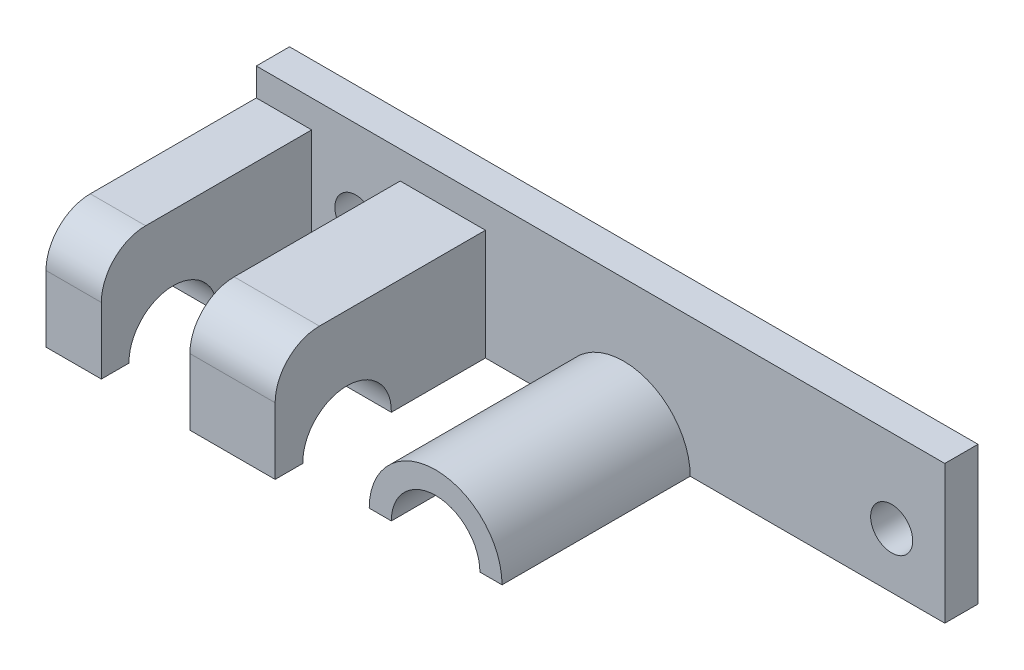
ISO-10303-21;
HEADER;
FILE_DESCRIPTION(('STEP AP214'),'2;1');
FILE_NAME('part.step','',(''),(''),'','','');
FILE_SCHEMA(('AUTOMOTIVE_DESIGN { 1 0 10303 214 1 1 1 1 }'));
ENDSEC;
DATA;
#1=APPLICATION_CONTEXT('core data for automotive mechanical design processes');
#2=APPLICATION_PROTOCOL_DEFINITION('international standard','automotive_design',2000,#1);
#3=PRODUCT_CONTEXT('',#1,'mechanical');
#4=PRODUCT('Part','Part','',(#3));
#5=PRODUCT_RELATED_PRODUCT_CATEGORY('part','',(#4));
#6=PRODUCT_DEFINITION_FORMATION('','',#4);
#7=PRODUCT_DEFINITION_CONTEXT('part definition',#1,'design');
#8=PRODUCT_DEFINITION('design','',#6,#7);
#9=PRODUCT_DEFINITION_SHAPE('','',#8);
#10=(LENGTH_UNIT() NAMED_UNIT(*) SI_UNIT(.MILLI.,.METRE.));
#11=(NAMED_UNIT(*) PLANE_ANGLE_UNIT() SI_UNIT($,.RADIAN.));
#12=(NAMED_UNIT(*) SI_UNIT($,.STERADIAN.) SOLID_ANGLE_UNIT());
#13=UNCERTAINTY_MEASURE_WITH_UNIT(LENGTH_MEASURE(1.E-05),#10,'distance_accuracy_value','');
#14=(GEOMETRIC_REPRESENTATION_CONTEXT(3) GLOBAL_UNCERTAINTY_ASSIGNED_CONTEXT((#13)) GLOBAL_UNIT_ASSIGNED_CONTEXT((#10,
#11,#12)) REPRESENTATION_CONTEXT('',''));
#15=CARTESIAN_POINT('',(0.,0.,0.));
#16=DIRECTION('',(0.,0.,1.));
#17=DIRECTION('',(1.,0.,0.));
#18=AXIS2_PLACEMENT_3D('',#15,#16,#17);
#19=CARTESIAN_POINT('',(0.,0.,3.));
#20=DIRECTION('',(0.,0.,1.));
#21=DIRECTION('',(1.,0.,0.));
#22=AXIS2_PLACEMENT_3D('',#19,#20,#21);
#23=PLANE('',#22);
#24=DIRECTION('',(-1.,0.,0.));
#25=VECTOR('',#24,1.);
#26=CARTESIAN_POINT('',(0.,0.,3.));
#27=LINE('',#26,#25);
#28=CARTESIAN_POINT('',(29.,0.,3.));
#29=VERTEX_POINT('',#28);
#30=CARTESIAN_POINT('',(6.,0.,3.));
#31=VERTEX_POINT('',#30);
#32=EDGE_CURVE('E326',#29,#31,#27,.T.);
#33=ORIENTED_EDGE('',*,*,#32,.F.);
#34=DIRECTION('',(0.,1.,0.));
#35=VECTOR('',#34,1.);
#36=CARTESIAN_POINT('',(29.,12.5,3.));
#37=LINE('',#36,#35);
#38=CARTESIAN_POINT('',(29.,12.5,3.));
#39=VERTEX_POINT('',#38);
#40=EDGE_CURVE('E287',#29,#39,#37,.T.);
#41=ORIENTED_EDGE('',*,*,#40,.T.);
#42=DIRECTION('',(-1.,0.,0.));
#43=VECTOR('',#42,1.);
#44=CARTESIAN_POINT('',(-29.,12.5,3.));
#45=LINE('',#44,#43);
#46=CARTESIAN_POINT('',(-33.2,12.5,3.));
#47=VERTEX_POINT('',#46);
#48=EDGE_CURVE('E289',#39,#47,#45,.T.);
#49=ORIENTED_EDGE('',*,*,#48,.T.);
#50=DIRECTION('',(0.,-1.,0.));
#51=VECTOR('',#50,1.);
#52=CARTESIAN_POINT('',(-33.2,12.5,3.));
#53=LINE('',#52,#51);
#54=CARTESIAN_POINT('',(-33.2,9.9981412265895,3.));
#55=VERTEX_POINT('',#54);
#56=EDGE_CURVE('E229',#47,#55,#53,.T.);
#57=ORIENTED_EDGE('',*,*,#56,.T.);
#58=DIRECTION('',(-1.,0.,0.));
#59=VECTOR('',#58,1.);
#60=CARTESIAN_POINT('',(-28.2,9.9981412265895,3.));
#61=LINE('',#60,#59);
#62=CARTESIAN_POINT('',(-28.2,9.9981412265895,3.));
#63=VERTEX_POINT('',#62);
#64=EDGE_CURVE('E218',#63,#55,#61,.T.);
#65=ORIENTED_EDGE('',*,*,#64,.F.);
#66=DIRECTION('',(0.,1.,0.));
#67=VECTOR('',#66,1.);
#68=CARTESIAN_POINT('',(-28.2,9.9981412265895,3.));
#69=LINE('',#68,#67);
#70=CARTESIAN_POINT('',(-28.2,0.,3.));
#71=VERTEX_POINT('',#70);
#72=EDGE_CURVE('E222',#71,#63,#69,.T.);
#73=ORIENTED_EDGE('',*,*,#72,.F.);
#74=CARTESIAN_POINT('',(-20.2,0.,3.));
#75=VERTEX_POINT('',#74);
#76=EDGE_CURVE('E354',#75,#71,#27,.T.);
#77=ORIENTED_EDGE('',*,*,#76,.F.);
#78=DIRECTION('',(0.,-1.,0.));
#79=VECTOR('',#78,1.);
#80=CARTESIAN_POINT('',(-20.2,9.9981412265895,3.));
#81=LINE('',#80,#79);
#82=CARTESIAN_POINT('',(-20.2,9.9981412265895,3.));
#83=VERTEX_POINT('',#82);
#84=EDGE_CURVE('E248',#83,#75,#81,.T.);
#85=ORIENTED_EDGE('',*,*,#84,.F.);
#86=DIRECTION('',(-1.,0.,0.));
#87=VECTOR('',#86,1.);
#88=CARTESIAN_POINT('',(-20.2,9.9981412265895,3.));
#89=LINE('',#88,#87);
#90=CARTESIAN_POINT('',(-12.5,9.9981412265895,3.));
#91=VERTEX_POINT('',#90);
#92=EDGE_CURVE('E253',#91,#83,#89,.T.);
#93=ORIENTED_EDGE('',*,*,#92,.F.);
#94=DIRECTION('',(0.,1.,0.));
#95=VECTOR('',#94,1.);
#96=CARTESIAN_POINT('',(-12.5,9.9981412265895,3.));
#97=LINE('',#96,#95);
#98=CARTESIAN_POINT('',(-12.5,0.,3.));
#99=VERTEX_POINT('',#98);
#100=EDGE_CURVE('E244',#99,#91,#97,.T.);
#101=ORIENTED_EDGE('',*,*,#100,.F.);
#102=CARTESIAN_POINT('',(-6.,0.,3.));
#103=VERTEX_POINT('',#102);
#104=EDGE_CURVE('E344',#103,#99,#27,.T.);
#105=ORIENTED_EDGE('',*,*,#104,.F.);
#106=CARTESIAN_POINT('',(0.,0.,3.));
#107=DIRECTION('',(0.,0.,1.));
#108=DIRECTION('',(1.,0.,0.));
#109=AXIS2_PLACEMENT_3D('',#106,#107,#108);
#110=CIRCLE('',#109,6.);
#111=EDGE_CURVE('E271',#103,#31,#110,.F.);
#112=ORIENTED_EDGE('',*,*,#111,.T.);
#113=EDGE_LOOP('',(#33,#41,#49,#57,#65,#73,#77,#85,#93,#101,#105,#112));
#114=FACE_BOUND('',#113,.T.);
#115=CARTESIAN_POINT('',(-24.2,5.,3.));
#116=DIRECTION('',(0.,0.,1.));
#117=DIRECTION('',(1.,0.,0.));
#118=AXIS2_PLACEMENT_3D('',#115,#116,#117);
#119=CIRCLE('',#118,1.9);
#120=CARTESIAN_POINT('',(-22.3,5.,3.));
#121=VERTEX_POINT('',#120);
#122=EDGE_CURVE('E275',#121,#121,#119,.T.);
#123=ORIENTED_EDGE('',*,*,#122,.F.);
#124=EDGE_LOOP('',(#123));
#125=FACE_BOUND('',#124,.T.);
#126=CARTESIAN_POINT('',(24.2,5.,3.));
#127=DIRECTION('',(0.,0.,1.));
#128=DIRECTION('',(1.,0.,0.));
#129=AXIS2_PLACEMENT_3D('',#126,#127,#128);
#130=CIRCLE('',#129,1.9);
#131=CARTESIAN_POINT('',(26.1,5.,3.));
#132=VERTEX_POINT('',#131);
#133=EDGE_CURVE('E281',#132,#132,#130,.T.);
#134=ORIENTED_EDGE('',*,*,#133,.F.);
#135=EDGE_LOOP('',(#134));
#136=FACE_BOUND('',#135,.T.);
#137=ADVANCED_FACE('F45',(#114,#125,#136),#23,.T.);
#138=CARTESIAN_POINT('',(0.,0.,0.));
#139=DIRECTION('',(0.,0.,1.));
#140=DIRECTION('',(1.,0.,0.));
#141=AXIS2_PLACEMENT_3D('',#138,#139,#140);
#142=PLANE('',#141);
#143=DIRECTION('',(0.,1.,0.));
#144=VECTOR('',#143,1.);
#145=CARTESIAN_POINT('',(29.,12.5,0.));
#146=LINE('',#145,#144);
#147=CARTESIAN_POINT('',(29.,0.,0.));
#148=VERTEX_POINT('',#147);
#149=CARTESIAN_POINT('',(29.,12.5,0.));
#150=VERTEX_POINT('',#149);
#151=EDGE_CURVE('E284',#148,#150,#146,.T.);
#152=ORIENTED_EDGE('',*,*,#151,.F.);
#153=DIRECTION('',(1.,0.,0.));
#154=VECTOR('',#153,1.);
#155=CARTESIAN_POINT('',(29.,0.,0.));
#156=LINE('',#155,#154);
#157=CARTESIAN_POINT('',(4.,0.,0.));
#158=VERTEX_POINT('',#157);
#159=EDGE_CURVE('E360',#158,#148,#156,.T.);
#160=ORIENTED_EDGE('',*,*,#159,.F.);
#161=CARTESIAN_POINT('',(0.,0.,0.));
#162=DIRECTION('',(0.,0.,1.));
#163=DIRECTION('',(1.,0.,0.));
#164=AXIS2_PLACEMENT_3D('',#161,#162,#163);
#165=CIRCLE('',#164,4.);
#166=CARTESIAN_POINT('',(-4.,0.,0.));
#167=VERTEX_POINT('',#166);
#168=EDGE_CURVE('E263',#158,#167,#165,.T.);
#169=ORIENTED_EDGE('',*,*,#168,.T.);
#170=CARTESIAN_POINT('',(-33.2,0.,0.));
#171=VERTEX_POINT('',#170);
#172=EDGE_CURVE('E359',#171,#167,#156,.T.);
#173=ORIENTED_EDGE('',*,*,#172,.F.);
#174=DIRECTION('',(0.,-1.,0.));
#175=VECTOR('',#174,1.);
#176=CARTESIAN_POINT('',(-33.2,12.5,0.));
#177=LINE('',#176,#175);
#178=CARTESIAN_POINT('',(-33.2,12.5,0.));
#179=VERTEX_POINT('',#178);
#180=EDGE_CURVE('E230',#179,#171,#177,.T.);
#181=ORIENTED_EDGE('',*,*,#180,.F.);
#182=DIRECTION('',(-1.,0.,0.));
#183=VECTOR('',#182,1.);
#184=CARTESIAN_POINT('',(-29.,12.5,0.));
#185=LINE('',#184,#183);
#186=EDGE_CURVE('E290',#150,#179,#185,.T.);
#187=ORIENTED_EDGE('',*,*,#186,.F.);
#188=EDGE_LOOP('',(#152,#160,#169,#173,#181,#187));
#189=FACE_BOUND('',#188,.T.);
#190=CARTESIAN_POINT('',(24.2,5.,0.));
#191=DIRECTION('',(0.,0.,1.));
#192=DIRECTION('',(1.,0.,0.));
#193=AXIS2_PLACEMENT_3D('',#190,#191,#192);
#194=CIRCLE('',#193,1.9);
#195=CARTESIAN_POINT('',(26.1,5.,0.));
#196=VERTEX_POINT('',#195);
#197=EDGE_CURVE('E278',#196,#196,#194,.T.);
#198=ORIENTED_EDGE('',*,*,#197,.T.);
#199=EDGE_LOOP('',(#198));
#200=FACE_BOUND('',#199,.T.);
#201=CARTESIAN_POINT('',(-24.2,5.,0.));
#202=DIRECTION('',(0.,0.,1.));
#203=DIRECTION('',(1.,0.,0.));
#204=AXIS2_PLACEMENT_3D('',#201,#202,#203);
#205=CIRCLE('',#204,1.9);
#206=CARTESIAN_POINT('',(-22.3,5.,0.));
#207=VERTEX_POINT('',#206);
#208=EDGE_CURVE('E274',#207,#207,#205,.T.);
#209=ORIENTED_EDGE('',*,*,#208,.T.);
#210=EDGE_LOOP('',(#209));
#211=FACE_BOUND('',#210,.T.);
#212=ADVANCED_FACE('F374',(#189,#200,#211),#142,.F.);
#213=CARTESIAN_POINT('',(29.,12.5,3.));
#214=DIRECTION('',(-1.,0.,0.));
#215=DIRECTION('',(0.,0.,1.));
#216=AXIS2_PLACEMENT_3D('',#213,#214,#215);
#217=PLANE('',#216);
#218=ORIENTED_EDGE('',*,*,#40,.F.);
#219=DIRECTION('',(0.,0.,-1.));
#220=VECTOR('',#219,1.);
#221=CARTESIAN_POINT('',(29.,0.,22.));
#222=LINE('',#221,#220);
#223=EDGE_CURVE('E207',#29,#148,#222,.T.);
#224=ORIENTED_EDGE('',*,*,#223,.T.);
#225=ORIENTED_EDGE('',*,*,#151,.T.);
#226=DIRECTION('',(0.,0.,-1.));
#227=VECTOR('',#226,1.);
#228=CARTESIAN_POINT('',(29.,12.5,3.));
#229=LINE('',#228,#227);
#230=EDGE_CURVE('E292',#39,#150,#229,.T.);
#231=ORIENTED_EDGE('',*,*,#230,.F.);
#232=EDGE_LOOP('',(#218,#224,#225,#231));
#233=FACE_BOUND('',#232,.T.);
#234=ADVANCED_FACE('F371',(#233),#217,.F.);
#235=CARTESIAN_POINT('',(-29.,12.5,3.));
#236=DIRECTION('',(0.,-1.,0.));
#237=DIRECTION('',(0.,0.,-1.));
#238=AXIS2_PLACEMENT_3D('',#235,#236,#237);
#239=PLANE('',#238);
#240=ORIENTED_EDGE('',*,*,#186,.T.);
#241=DIRECTION('',(0.,0.,1.));
#242=VECTOR('',#241,1.);
#243=CARTESIAN_POINT('',(-33.2,12.5,0.));
#244=LINE('',#243,#242);
#245=EDGE_CURVE('E233',#179,#47,#244,.T.);
#246=ORIENTED_EDGE('',*,*,#245,.T.);
#247=ORIENTED_EDGE('',*,*,#48,.F.);
#248=ORIENTED_EDGE('',*,*,#230,.T.);
#249=EDGE_LOOP('',(#240,#246,#247,#248));
#250=FACE_BOUND('',#249,.T.);
#251=ADVANCED_FACE('F380',(#250),#239,.F.);
#252=CARTESIAN_POINT('',(24.2,5.,3.));
#253=DIRECTION('',(0.,0.,-1.));
#254=DIRECTION('',(-1.,0.,0.));
#255=AXIS2_PLACEMENT_3D('',#252,#253,#254);
#256=CYLINDRICAL_SURFACE('',#255,1.9);
#257=ORIENTED_EDGE('',*,*,#133,.T.);
#258=EDGE_LOOP('',(#257));
#259=FACE_BOUND('',#258,.T.);
#260=ORIENTED_EDGE('',*,*,#197,.F.);
#261=EDGE_LOOP('',(#260));
#262=FACE_BOUND('',#261,.T.);
#263=ADVANCED_FACE('F439',(#259,#262),#256,.F.);
#264=CARTESIAN_POINT('',(-24.2,5.,3.));
#265=DIRECTION('',(0.,0.,-1.));
#266=DIRECTION('',(-1.,0.,0.));
#267=AXIS2_PLACEMENT_3D('',#264,#265,#266);
#268=CYLINDRICAL_SURFACE('',#267,1.9);
#269=ORIENTED_EDGE('',*,*,#122,.T.);
#270=EDGE_LOOP('',(#269));
#271=FACE_BOUND('',#270,.T.);
#272=ORIENTED_EDGE('',*,*,#208,.F.);
#273=EDGE_LOOP('',(#272));
#274=FACE_BOUND('',#273,.T.);
#275=ADVANCED_FACE('F431',(#271,#274),#268,.F.);
#276=CARTESIAN_POINT('',(0.,0.,20.));
#277=DIRECTION('',(0.,0.,-1.));
#278=DIRECTION('',(-1.,0.,0.));
#279=AXIS2_PLACEMENT_3D('',#276,#277,#278);
#280=CYLINDRICAL_SURFACE('',#279,6.);
#281=CARTESIAN_POINT('',(0.,0.,20.));
#282=DIRECTION('',(0.,0.,1.));
#283=DIRECTION('',(1.,0.,0.));
#284=AXIS2_PLACEMENT_3D('',#281,#282,#283);
#285=CIRCLE('',#284,6.);
#286=CARTESIAN_POINT('',(6.,0.,20.));
#287=VERTEX_POINT('',#286);
#288=CARTESIAN_POINT('',(-6.,0.,20.));
#289=VERTEX_POINT('',#288);
#290=EDGE_CURVE('E266',#287,#289,#285,.T.);
#291=ORIENTED_EDGE('',*,*,#290,.F.);
#292=DIRECTION('',(0.,0.,-1.));
#293=VECTOR('',#292,1.);
#294=CARTESIAN_POINT('',(6.,0.,20.));
#295=LINE('',#294,#293);
#296=EDGE_CURVE('E328',#287,#31,#295,.T.);
#297=ORIENTED_EDGE('',*,*,#296,.T.);
#298=ORIENTED_EDGE('',*,*,#111,.F.);
#299=DIRECTION('',(0.,0.,-1.));
#300=VECTOR('',#299,1.);
#301=CARTESIAN_POINT('',(-6.,0.,20.));
#302=LINE('',#301,#300);
#303=EDGE_CURVE('E341',#103,#289,#302,.F.);
#304=ORIENTED_EDGE('',*,*,#303,.T.);
#305=EDGE_LOOP('',(#291,#297,#298,#304));
#306=FACE_BOUND('',#305,.T.);
#307=ADVANCED_FACE('F429',(#306),#280,.T.);
#308=CARTESIAN_POINT('',(0.,0.,20.));
#309=DIRECTION('',(0.,0.,1.));
#310=DIRECTION('',(1.,0.,0.));
#311=AXIS2_PLACEMENT_3D('',#308,#309,#310);
#312=PLANE('',#311);
#313=DIRECTION('',(-1.,0.,0.));
#314=VECTOR('',#313,1.);
#315=CARTESIAN_POINT('',(0.,0.,20.));
#316=LINE('',#315,#314);
#317=CARTESIAN_POINT('',(4.,0.,20.));
#318=VERTEX_POINT('',#317);
#319=EDGE_CURVE('E60',#287,#318,#316,.T.);
#320=ORIENTED_EDGE('',*,*,#319,.F.);
#321=ORIENTED_EDGE('',*,*,#290,.T.);
#322=CARTESIAN_POINT('',(-4.,0.,20.));
#323=VERTEX_POINT('',#322);
#324=EDGE_CURVE('E339',#323,#289,#316,.T.);
#325=ORIENTED_EDGE('',*,*,#324,.F.);
#326=CARTESIAN_POINT('',(0.,0.,20.));
#327=DIRECTION('',(0.,0.,1.));
#328=DIRECTION('',(1.,0.,0.));
#329=AXIS2_PLACEMENT_3D('',#326,#327,#328);
#330=CIRCLE('',#329,4.);
#331=EDGE_CURVE('E262',#318,#323,#330,.T.);
#332=ORIENTED_EDGE('',*,*,#331,.F.);
#333=EDGE_LOOP('',(#320,#321,#325,#332));
#334=FACE_BOUND('',#333,.T.);
#335=ADVANCED_FACE('F426',(#334),#312,.T.);
#336=CARTESIAN_POINT('',(0.,0.,0.));
#337=DIRECTION('',(0.,0.,1.));
#338=DIRECTION('',(1.,0.,0.));
#339=AXIS2_PLACEMENT_3D('',#336,#337,#338);
#340=CYLINDRICAL_SURFACE('',#339,4.);
#341=ORIENTED_EDGE('',*,*,#331,.T.);
#342=DIRECTION('',(0.,0.,1.));
#343=VECTOR('',#342,1.);
#344=CARTESIAN_POINT('',(-4.,0.,0.));
#345=LINE('',#344,#343);
#346=EDGE_CURVE('E336',#323,#167,#345,.F.);
#347=ORIENTED_EDGE('',*,*,#346,.T.);
#348=ORIENTED_EDGE('',*,*,#168,.F.);
#349=DIRECTION('',(0.,0.,1.));
#350=VECTOR('',#349,1.);
#351=CARTESIAN_POINT('',(4.,0.,0.));
#352=LINE('',#351,#350);
#353=EDGE_CURVE('E331',#158,#318,#352,.T.);
#354=ORIENTED_EDGE('',*,*,#353,.T.);
#355=EDGE_LOOP('',(#341,#347,#348,#354));
#356=FACE_BOUND('',#355,.T.);
#357=ADVANCED_FACE('F422',(#356),#340,.F.);
#358=CARTESIAN_POINT('',(-12.5,9.9981412265895,22.));
#359=DIRECTION('',(-1.,0.,0.));
#360=DIRECTION('',(0.,-1.,0.));
#361=AXIS2_PLACEMENT_3D('',#358,#359,#360);
#362=PLANE('',#361);
#363=DIRECTION('',(0.,1.,0.));
#364=VECTOR('',#363,1.);
#365=CARTESIAN_POINT('',(-12.5,9.9981412265895,22.));
#366=LINE('',#365,#364);
#367=CARTESIAN_POINT('',(-12.5,0.,22.));
#368=VERTEX_POINT('',#367);
#369=CARTESIAN_POINT('',(-12.5,5.9981412265895,22.));
#370=VERTEX_POINT('',#369);
#371=EDGE_CURVE('E245',#368,#370,#366,.T.);
#372=ORIENTED_EDGE('',*,*,#371,.F.);
#373=DIRECTION('',(0.,0.,-1.));
#374=VECTOR('',#373,1.);
#375=CARTESIAN_POINT('',(-12.5,0.,22.));
#376=LINE('',#375,#374);
#377=CARTESIAN_POINT('',(-12.5,0.,19.4991832930463));
#378=VERTEX_POINT('',#377);
#379=EDGE_CURVE('E333',#368,#378,#376,.T.);
#380=ORIENTED_EDGE('',*,*,#379,.T.);
#381=CARTESIAN_POINT('',(-12.5,0.0808269052919655,15.5));
#382=DIRECTION('',(-1.,0.,0.));
#383=DIRECTION('',(0.,-1.,0.));
#384=AXIS2_PLACEMENT_3D('',#381,#382,#383);
#385=CIRCLE('',#384,4.);
#386=CARTESIAN_POINT('',(-12.5,0.,11.5008167069537));
#387=VERTEX_POINT('',#386);
#388=EDGE_CURVE('E238',#387,#378,#385,.F.);
#389=ORIENTED_EDGE('',*,*,#388,.F.);
#390=EDGE_CURVE('E345',#387,#99,#376,.T.);
#391=ORIENTED_EDGE('',*,*,#390,.T.);
#392=ORIENTED_EDGE('',*,*,#100,.T.);
#393=DIRECTION('',(0.,0.,-1.));
#394=VECTOR('',#393,1.);
#395=CARTESIAN_POINT('',(-12.5,9.9981412265895,22.));
#396=LINE('',#395,#394);
#397=CARTESIAN_POINT('',(-12.5,9.9981412265895,18.));
#398=VERTEX_POINT('',#397);
#399=EDGE_CURVE('E259',#398,#91,#396,.T.);
#400=ORIENTED_EDGE('',*,*,#399,.F.);
#401=CARTESIAN_POINT('',(-12.5,5.9981412265895,18.));
#402=DIRECTION('',(-1.,0.,0.));
#403=DIRECTION('',(0.,-1.,0.));
#404=AXIS2_PLACEMENT_3D('',#401,#402,#403);
#405=CIRCLE('',#404,4.);
#406=EDGE_CURVE('E300',#398,#370,#405,.F.);
#407=ORIENTED_EDGE('',*,*,#406,.T.);
#408=EDGE_LOOP('',(#372,#380,#389,#391,#392,#400,#407));
#409=FACE_BOUND('',#408,.T.);
#410=ADVANCED_FACE('F392',(#409),#362,.F.);
#411=CARTESIAN_POINT('',(-20.2,9.9981412265895,22.));
#412=DIRECTION('',(0.,-1.,0.));
#413=DIRECTION('',(0.,0.,-1.));
#414=AXIS2_PLACEMENT_3D('',#411,#412,#413);
#415=PLANE('',#414);
#416=DIRECTION('',(0.,0.,-1.));
#417=VECTOR('',#416,1.);
#418=CARTESIAN_POINT('',(-20.2,9.9981412265895,22.));
#419=LINE('',#418,#417);
#420=CARTESIAN_POINT('',(-20.2,9.9981412265895,18.));
#421=VERTEX_POINT('',#420);
#422=EDGE_CURVE('E251',#421,#83,#419,.T.);
#423=ORIENTED_EDGE('',*,*,#422,.F.);
#424=DIRECTION('',(-1.,0.,0.));
#425=VECTOR('',#424,1.);
#426=CARTESIAN_POINT('',(-12.5,9.9981412265895,18.));
#427=LINE('',#426,#425);
#428=EDGE_CURVE('E305',#421,#398,#427,.F.);
#429=ORIENTED_EDGE('',*,*,#428,.T.);
#430=ORIENTED_EDGE('',*,*,#399,.T.);
#431=ORIENTED_EDGE('',*,*,#92,.T.);
#432=EDGE_LOOP('',(#423,#429,#430,#431));
#433=FACE_BOUND('',#432,.T.);
#434=ADVANCED_FACE('F400',(#433),#415,.F.);
#435=CARTESIAN_POINT('',(-20.2,9.9981412265895,22.));
#436=DIRECTION('',(1.,0.,0.));
#437=DIRECTION('',(0.,0.,-1.));
#438=AXIS2_PLACEMENT_3D('',#435,#436,#437);
#439=PLANE('',#438);
#440=ORIENTED_EDGE('',*,*,#84,.T.);
#441=DIRECTION('',(0.,0.,1.));
#442=VECTOR('',#441,1.);
#443=CARTESIAN_POINT('',(-20.2,0.,22.));
#444=LINE('',#443,#442);
#445=CARTESIAN_POINT('',(-20.2,0.,11.5008167069537));
#446=VERTEX_POINT('',#445);
#447=EDGE_CURVE('E351',#75,#446,#444,.T.);
#448=ORIENTED_EDGE('',*,*,#447,.T.);
#449=CARTESIAN_POINT('',(-20.2,0.0808269052919655,15.5));
#450=DIRECTION('',(-1.,0.,0.));
#451=DIRECTION('',(0.,0.,1.));
#452=AXIS2_PLACEMENT_3D('',#449,#450,#451);
#453=CIRCLE('',#452,4.);
#454=CARTESIAN_POINT('',(-20.2,0.,19.4991832930463));
#455=VERTEX_POINT('',#454);
#456=EDGE_CURVE('E241',#455,#446,#453,.T.);
#457=ORIENTED_EDGE('',*,*,#456,.F.);
#458=CARTESIAN_POINT('',(-20.2,0.,22.));
#459=VERTEX_POINT('',#458);
#460=EDGE_CURVE('E68',#455,#459,#444,.T.);
#461=ORIENTED_EDGE('',*,*,#460,.T.);
#462=DIRECTION('',(0.,-1.,0.));
#463=VECTOR('',#462,1.);
#464=CARTESIAN_POINT('',(-20.2,9.9981412265895,22.));
#465=LINE('',#464,#463);
#466=CARTESIAN_POINT('',(-20.2,5.9981412265895,22.));
#467=VERTEX_POINT('',#466);
#468=EDGE_CURVE('E247',#467,#459,#465,.T.);
#469=ORIENTED_EDGE('',*,*,#468,.F.);
#470=CARTESIAN_POINT('',(-20.2,5.9981412265895,18.));
#471=DIRECTION('',(1.,0.,0.));
#472=DIRECTION('',(0.,0.,-1.));
#473=AXIS2_PLACEMENT_3D('',#470,#471,#472);
#474=CIRCLE('',#473,4.);
#475=EDGE_CURVE('E303',#467,#421,#474,.F.);
#476=ORIENTED_EDGE('',*,*,#475,.T.);
#477=ORIENTED_EDGE('',*,*,#422,.T.);
#478=EDGE_LOOP('',(#440,#448,#457,#461,#469,#476,#477));
#479=FACE_BOUND('',#478,.T.);
#480=ADVANCED_FACE('F410',(#479),#439,.F.);
#481=CARTESIAN_POINT('',(0.,0.,22.));
#482=DIRECTION('',(0.,0.,1.));
#483=DIRECTION('',(1.,0.,0.));
#484=AXIS2_PLACEMENT_3D('',#481,#482,#483);
#485=PLANE('',#484);
#486=DIRECTION('',(1.,0.,0.));
#487=VECTOR('',#486,1.);
#488=CARTESIAN_POINT('',(29.,0.,22.));
#489=LINE('',#488,#487);
#490=EDGE_CURVE('E197',#459,#368,#489,.T.);
#491=ORIENTED_EDGE('',*,*,#490,.T.);
#492=ORIENTED_EDGE('',*,*,#371,.T.);
#493=DIRECTION('',(-1.,0.,0.));
#494=VECTOR('',#493,1.);
#495=CARTESIAN_POINT('',(-20.2,5.9981412265895,22.));
#496=LINE('',#495,#494);
#497=EDGE_CURVE('E297',#370,#467,#496,.T.);
#498=ORIENTED_EDGE('',*,*,#497,.T.);
#499=ORIENTED_EDGE('',*,*,#468,.T.);
#500=EDGE_LOOP('',(#491,#492,#498,#499));
#501=FACE_BOUND('',#500,.T.);
#502=ADVANCED_FACE('F408',(#501),#485,.T.);
#503=CARTESIAN_POINT('',(29.001,0.0808269052919655,15.5));
#504=DIRECTION('',(-1.,0.,0.));
#505=DIRECTION('',(0.,0.,1.));
#506=AXIS2_PLACEMENT_3D('',#503,#504,#505);
#507=CYLINDRICAL_SURFACE('',#506,4.);
#508=ORIENTED_EDGE('',*,*,#456,.T.);
#509=DIRECTION('',(-1.,0.,0.));
#510=VECTOR('',#509,1.);
#511=CARTESIAN_POINT('',(29.001,0.,11.5008167069537));
#512=LINE('',#511,#510);
#513=EDGE_CURVE('E348',#446,#387,#512,.F.);
#514=ORIENTED_EDGE('',*,*,#513,.T.);
#515=ORIENTED_EDGE('',*,*,#388,.T.);
#516=DIRECTION('',(-1.,0.,0.));
#517=VECTOR('',#516,1.);
#518=CARTESIAN_POINT('',(29.001,0.,19.4991832930463));
#519=LINE('',#518,#517);
#520=EDGE_CURVE('E334',#378,#455,#519,.T.);
#521=ORIENTED_EDGE('',*,*,#520,.T.);
#522=EDGE_LOOP('',(#508,#514,#515,#521));
#523=FACE_BOUND('',#522,.T.);
#524=ADVANCED_FACE('F413',(#523),#507,.F.);
#525=CARTESIAN_POINT('',(0.,5.9981412265895,18.));
#526=DIRECTION('',(1.,0.,0.));
#527=DIRECTION('',(0.,0.,-1.));
#528=AXIS2_PLACEMENT_3D('',#525,#526,#527);
#529=CYLINDRICAL_SURFACE('',#528,4.);
#530=ORIENTED_EDGE('',*,*,#406,.F.);
#531=ORIENTED_EDGE('',*,*,#428,.F.);
#532=ORIENTED_EDGE('',*,*,#475,.F.);
#533=ORIENTED_EDGE('',*,*,#497,.F.);
#534=EDGE_LOOP('',(#530,#531,#532,#533));
#535=FACE_BOUND('',#534,.T.);
#536=ADVANCED_FACE('F405',(#535),#529,.T.);
#537=CARTESIAN_POINT('',(-33.2,12.5,0.));
#538=DIRECTION('',(-1.,0.,0.));
#539=DIRECTION('',(0.,-1.,0.));
#540=AXIS2_PLACEMENT_3D('',#537,#538,#539);
#541=PLANE('',#540);
#542=DIRECTION('',(0.,0.,-1.));
#543=VECTOR('',#542,1.);
#544=CARTESIAN_POINT('',(-33.2,0.,22.));
#545=LINE('',#544,#543);
#546=CARTESIAN_POINT('',(-33.2,0.,22.));
#547=VERTEX_POINT('',#546);
#548=CARTESIAN_POINT('',(-33.2,0.,19.4994946966813));
#549=VERTEX_POINT('',#548);
#550=EDGE_CURVE('E190',#547,#549,#545,.T.);
#551=ORIENTED_EDGE('',*,*,#550,.F.);
#552=DIRECTION('',(0.,-1.,0.));
#553=VECTOR('',#552,1.);
#554=CARTESIAN_POINT('',(-33.2,9.9981412265895,22.));
#555=LINE('',#554,#553);
#556=CARTESIAN_POINT('',(-33.2,5.9981412265895,22.));
#557=VERTEX_POINT('',#556);
#558=EDGE_CURVE('E203',#557,#547,#555,.T.);
#559=ORIENTED_EDGE('',*,*,#558,.F.);
#560=CARTESIAN_POINT('',(-33.2,5.9981412265895,18.));
#561=DIRECTION('',(-1.,0.,0.));
#562=DIRECTION('',(0.,-1.,0.));
#563=AXIS2_PLACEMENT_3D('',#560,#561,#562);
#564=CIRCLE('',#563,4.);
#565=CARTESIAN_POINT('',(-33.2,9.9981412265895,18.));
#566=VERTEX_POINT('',#565);
#567=EDGE_CURVE('E311',#557,#566,#564,.T.);
#568=ORIENTED_EDGE('',*,*,#567,.T.);
#569=DIRECTION('',(0.,0.,-1.));
#570=VECTOR('',#569,1.);
#571=CARTESIAN_POINT('',(-33.2,9.9981412265895,22.));
#572=LINE('',#571,#570);
#573=EDGE_CURVE('E213',#566,#55,#572,.T.);
#574=ORIENTED_EDGE('',*,*,#573,.T.);
#575=ORIENTED_EDGE('',*,*,#56,.F.);
#576=ORIENTED_EDGE('',*,*,#245,.F.);
#577=ORIENTED_EDGE('',*,*,#180,.T.);
#578=CARTESIAN_POINT('',(-33.2,0.,11.5005053033187));
#579=VERTEX_POINT('',#578);
#580=EDGE_CURVE('E196',#579,#171,#545,.T.);
#581=ORIENTED_EDGE('',*,*,#580,.F.);
#582=CARTESIAN_POINT('',(-33.2,0.0635780718363604,15.5));
#583=DIRECTION('',(-1.,0.,0.));
#584=DIRECTION('',(0.,-1.,0.));
#585=AXIS2_PLACEMENT_3D('',#582,#583,#584);
#586=CIRCLE('',#585,4.);
#587=EDGE_CURVE('E206',#579,#549,#586,.F.);
#588=ORIENTED_EDGE('',*,*,#587,.T.);
#589=EDGE_LOOP('',(#551,#559,#568,#574,#575,#576,#577,#581,#588));
#590=FACE_BOUND('',#589,.T.);
#591=ADVANCED_FACE('F202',(#590),#541,.T.);
#592=CARTESIAN_POINT('',(-28.2,9.9981412265895,22.));
#593=DIRECTION('',(-1.,0.,0.));
#594=DIRECTION('',(0.,-1.,0.));
#595=AXIS2_PLACEMENT_3D('',#592,#593,#594);
#596=PLANE('',#595);
#597=DIRECTION('',(0.,1.,0.));
#598=VECTOR('',#597,1.);
#599=CARTESIAN_POINT('',(-28.2,9.9981412265895,22.));
#600=LINE('',#599,#598);
#601=CARTESIAN_POINT('',(-28.2,0.,22.));
#602=VERTEX_POINT('',#601);
#603=CARTESIAN_POINT('',(-28.2,5.9981412265895,22.));
#604=VERTEX_POINT('',#603);
#605=EDGE_CURVE('E214',#602,#604,#600,.T.);
#606=ORIENTED_EDGE('',*,*,#605,.F.);
#607=DIRECTION('',(0.,0.,-1.));
#608=VECTOR('',#607,1.);
#609=CARTESIAN_POINT('',(-28.2,0.,22.));
#610=LINE('',#609,#608);
#611=CARTESIAN_POINT('',(-28.2,0.,19.4994946966813));
#612=VERTEX_POINT('',#611);
#613=EDGE_CURVE('E192',#602,#612,#610,.T.);
#614=ORIENTED_EDGE('',*,*,#613,.T.);
#615=CARTESIAN_POINT('',(-28.2,0.0635780718363613,15.5));
#616=DIRECTION('',(1.,0.,0.));
#617=DIRECTION('',(0.,1.,0.));
#618=AXIS2_PLACEMENT_3D('',#615,#616,#617);
#619=CIRCLE('',#618,4.);
#620=CARTESIAN_POINT('',(-28.2,0.,11.5005053033187));
#621=VERTEX_POINT('',#620);
#622=EDGE_CURVE('E224',#621,#612,#619,.T.);
#623=ORIENTED_EDGE('',*,*,#622,.F.);
#624=EDGE_CURVE('E323',#621,#71,#610,.T.);
#625=ORIENTED_EDGE('',*,*,#624,.T.);
#626=ORIENTED_EDGE('',*,*,#72,.T.);
#627=DIRECTION('',(0.,0.,-1.));
#628=VECTOR('',#627,1.);
#629=CARTESIAN_POINT('',(-28.2,9.9981412265895,22.));
#630=LINE('',#629,#628);
#631=CARTESIAN_POINT('',(-28.2,9.9981412265895,18.));
#632=VERTEX_POINT('',#631);
#633=EDGE_CURVE('E216',#632,#63,#630,.T.);
#634=ORIENTED_EDGE('',*,*,#633,.F.);
#635=CARTESIAN_POINT('',(-28.2,5.9981412265895,18.));
#636=DIRECTION('',(-1.,0.,0.));
#637=DIRECTION('',(0.,-1.,0.));
#638=AXIS2_PLACEMENT_3D('',#635,#636,#637);
#639=CIRCLE('',#638,4.);
#640=EDGE_CURVE('E308',#632,#604,#639,.F.);
#641=ORIENTED_EDGE('',*,*,#640,.T.);
#642=EDGE_LOOP('',(#606,#614,#623,#625,#626,#634,#641));
#643=FACE_BOUND('',#642,.T.);
#644=ADVANCED_FACE('F322',(#643),#596,.F.);
#645=CARTESIAN_POINT('',(-28.2,9.9981412265895,22.));
#646=DIRECTION('',(0.,-1.,0.));
#647=DIRECTION('',(0.,0.,-1.));
#648=AXIS2_PLACEMENT_3D('',#645,#646,#647);
#649=PLANE('',#648);
#650=ORIENTED_EDGE('',*,*,#573,.F.);
#651=DIRECTION('',(-1.,0.,0.));
#652=VECTOR('',#651,1.);
#653=CARTESIAN_POINT('',(-28.2,9.9981412265895,18.));
#654=LINE('',#653,#652);
#655=EDGE_CURVE('E313',#566,#632,#654,.F.);
#656=ORIENTED_EDGE('',*,*,#655,.T.);
#657=ORIENTED_EDGE('',*,*,#633,.T.);
#658=ORIENTED_EDGE('',*,*,#64,.T.);
#659=EDGE_LOOP('',(#650,#656,#657,#658));
#660=FACE_BOUND('',#659,.T.);
#661=ADVANCED_FACE('F418',(#660),#649,.F.);
#662=CARTESIAN_POINT('',(0.,0.,22.));
#663=DIRECTION('',(0.,0.,-1.));
#664=DIRECTION('',(-1.,0.,0.));
#665=AXIS2_PLACEMENT_3D('',#662,#663,#664);
#666=PLANE('',#665);
#667=ORIENTED_EDGE('',*,*,#558,.T.);
#668=EDGE_CURVE('E187',#547,#602,#489,.T.);
#669=ORIENTED_EDGE('',*,*,#668,.T.);
#670=ORIENTED_EDGE('',*,*,#605,.T.);
#671=DIRECTION('',(-1.,0.,0.));
#672=VECTOR('',#671,1.);
#673=CARTESIAN_POINT('',(0.,5.9981412265895,22.));
#674=LINE('',#673,#672);
#675=EDGE_CURVE('E212',#604,#557,#674,.T.);
#676=ORIENTED_EDGE('',*,*,#675,.T.);
#677=EDGE_LOOP('',(#667,#669,#670,#676));
#678=FACE_BOUND('',#677,.T.);
#679=ADVANCED_FACE('F210',(#678),#666,.F.);
#680=CARTESIAN_POINT('',(-33.201,0.0635780718363604,15.5));
#681=DIRECTION('',(1.,0.,0.));
#682=DIRECTION('',(0.,1.,0.));
#683=AXIS2_PLACEMENT_3D('',#680,#681,#682);
#684=CYLINDRICAL_SURFACE('',#683,4.);
#685=ORIENTED_EDGE('',*,*,#622,.T.);
#686=DIRECTION('',(1.,0.,0.));
#687=VECTOR('',#686,1.);
#688=CARTESIAN_POINT('',(-33.201,0.,19.4994946966813));
#689=LINE('',#688,#687);
#690=EDGE_CURVE('E11',#612,#549,#689,.F.);
#691=ORIENTED_EDGE('',*,*,#690,.T.);
#692=ORIENTED_EDGE('',*,*,#587,.F.);
#693=DIRECTION('',(1.,0.,0.));
#694=VECTOR('',#693,1.);
#695=CARTESIAN_POINT('',(-33.201,0.,11.5005053033187));
#696=LINE('',#695,#694);
#697=EDGE_CURVE('E53',#579,#621,#696,.T.);
#698=ORIENTED_EDGE('',*,*,#697,.T.);
#699=EDGE_LOOP('',(#685,#691,#692,#698));
#700=FACE_BOUND('',#699,.T.);
#701=ADVANCED_FACE('F318',(#700),#684,.F.);
#702=CARTESIAN_POINT('',(0.,5.9981412265895,18.));
#703=DIRECTION('',(-1.,0.,0.));
#704=DIRECTION('',(0.,0.,1.));
#705=AXIS2_PLACEMENT_3D('',#702,#703,#704);
#706=CYLINDRICAL_SURFACE('',#705,4.);
#707=ORIENTED_EDGE('',*,*,#640,.F.);
#708=ORIENTED_EDGE('',*,*,#655,.F.);
#709=ORIENTED_EDGE('',*,*,#567,.F.);
#710=ORIENTED_EDGE('',*,*,#675,.F.);
#711=EDGE_LOOP('',(#707,#708,#709,#710));
#712=FACE_BOUND('',#711,.T.);
#713=ADVANCED_FACE('F47',(#712),#706,.T.);
#714=CARTESIAN_POINT('',(29.,0.,22.));
#715=DIRECTION('',(0.,1.,0.));
#716=DIRECTION('',(0.,0.,1.));
#717=AXIS2_PLACEMENT_3D('',#714,#715,#716);
#718=PLANE('',#717);
#719=ORIENTED_EDGE('',*,*,#324,.T.);
#720=ORIENTED_EDGE('',*,*,#303,.F.);
#721=ORIENTED_EDGE('',*,*,#104,.T.);
#722=ORIENTED_EDGE('',*,*,#390,.F.);
#723=ORIENTED_EDGE('',*,*,#513,.F.);
#724=ORIENTED_EDGE('',*,*,#447,.F.);
#725=ORIENTED_EDGE('',*,*,#76,.T.);
#726=ORIENTED_EDGE('',*,*,#624,.F.);
#727=ORIENTED_EDGE('',*,*,#697,.F.);
#728=ORIENTED_EDGE('',*,*,#580,.T.);
#729=ORIENTED_EDGE('',*,*,#172,.T.);
#730=ORIENTED_EDGE('',*,*,#346,.F.);
#731=EDGE_LOOP('',(#719,#720,#721,#722,#723,#724,#725,#726,#727,#728,#729,#730));
#732=FACE_BOUND('',#731,.T.);
#733=ADVANCED_FACE('F387',(#732),#718,.F.);
#734=ORIENTED_EDGE('',*,*,#668,.F.);
#735=ORIENTED_EDGE('',*,*,#550,.T.);
#736=ORIENTED_EDGE('',*,*,#690,.F.);
#737=ORIENTED_EDGE('',*,*,#613,.F.);
#738=EDGE_LOOP('',(#734,#735,#736,#737));
#739=FACE_BOUND('',#738,.T.);
#740=ADVANCED_FACE('F189',(#739),#718,.F.);
#741=ORIENTED_EDGE('',*,*,#490,.F.);
#742=ORIENTED_EDGE('',*,*,#460,.F.);
#743=ORIENTED_EDGE('',*,*,#520,.F.);
#744=ORIENTED_EDGE('',*,*,#379,.F.);
#745=EDGE_LOOP('',(#741,#742,#743,#744));
#746=FACE_BOUND('',#745,.T.);
#747=ADVANCED_FACE('F582',(#746),#718,.F.);
#748=ORIENTED_EDGE('',*,*,#32,.T.);
#749=ORIENTED_EDGE('',*,*,#296,.F.);
#750=ORIENTED_EDGE('',*,*,#319,.T.);
#751=ORIENTED_EDGE('',*,*,#353,.F.);
#752=ORIENTED_EDGE('',*,*,#159,.T.);
#753=ORIENTED_EDGE('',*,*,#223,.F.);
#754=EDGE_LOOP('',(#748,#749,#750,#751,#752,#753));
#755=FACE_BOUND('',#754,.T.);
#756=ADVANCED_FACE('F364',(#755),#718,.F.);
#757=CLOSED_SHELL('',(#137,#212,#234,#251,#263,#275,#307,#335,#357,#410,#434,#480,#502,#524,
#536,#591,#644,#661,#679,#701,#713,#733,#740,#747,#756));
#758=MANIFOLD_SOLID_BREP('B2',#757);
#759=ADVANCED_BREP_SHAPE_REPRESENTATION('',(#18,#758),#14);
#760=SHAPE_DEFINITION_REPRESENTATION(#9,#759);
ENDSEC;
END-ISO-10303-21;
